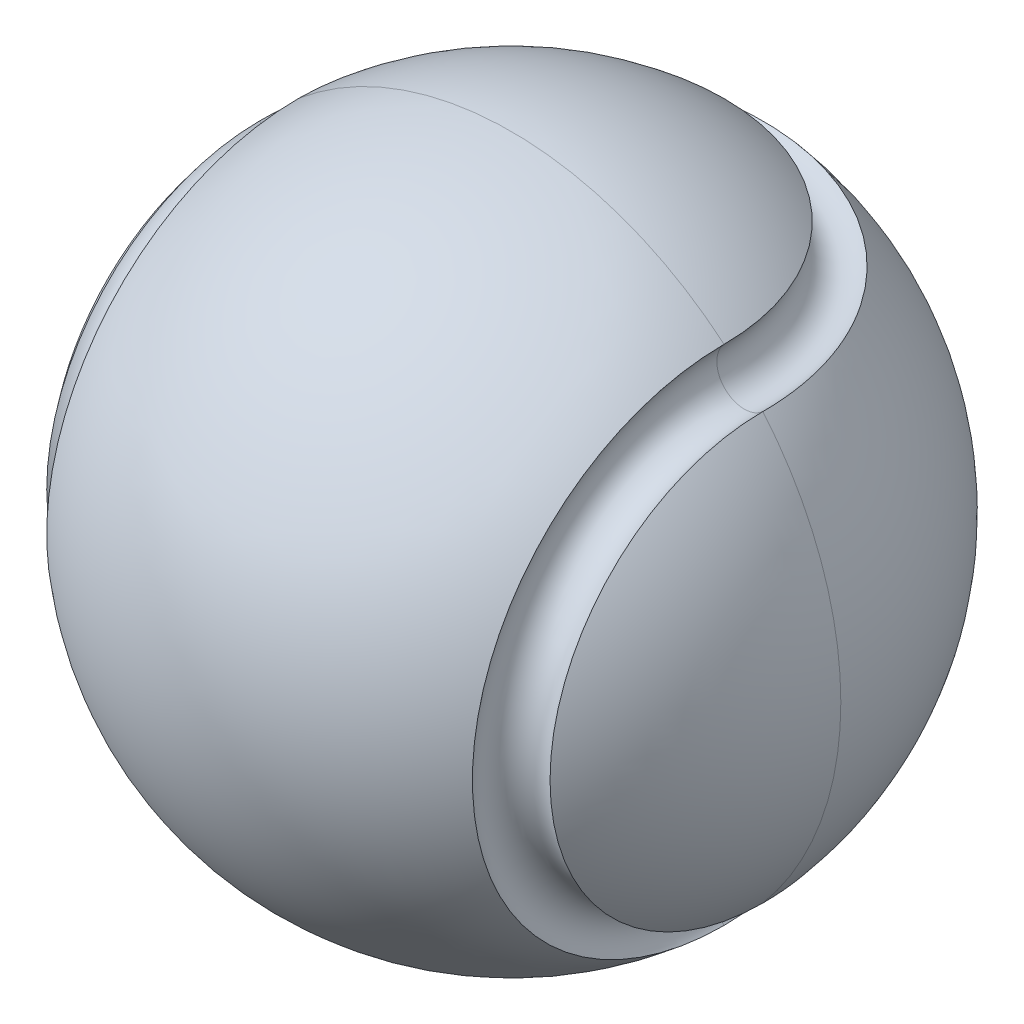
ISO-10303-21;
HEADER;
FILE_DESCRIPTION(('STEP AP214'),'2;1');
FILE_NAME('part.step','',(''),(''),'','','');
FILE_SCHEMA(('AUTOMOTIVE_DESIGN { 1 0 10303 214 1 1 1 1 }'));
ENDSEC;
DATA;
#1=APPLICATION_CONTEXT('core data for automotive mechanical design processes');
#2=APPLICATION_PROTOCOL_DEFINITION('international standard','automotive_design',2000,#1);
#3=PRODUCT_CONTEXT('',#1,'mechanical');
#4=PRODUCT('Part','Part','',(#3));
#5=PRODUCT_RELATED_PRODUCT_CATEGORY('part','',(#4));
#6=PRODUCT_DEFINITION_FORMATION('','',#4);
#7=PRODUCT_DEFINITION_CONTEXT('part definition',#1,'design');
#8=PRODUCT_DEFINITION('design','',#6,#7);
#9=PRODUCT_DEFINITION_SHAPE('','',#8);
#10=(LENGTH_UNIT() NAMED_UNIT(*) SI_UNIT(.MILLI.,.METRE.));
#11=(NAMED_UNIT(*) PLANE_ANGLE_UNIT() SI_UNIT($,.RADIAN.));
#12=(NAMED_UNIT(*) SI_UNIT($,.STERADIAN.) SOLID_ANGLE_UNIT());
#13=UNCERTAINTY_MEASURE_WITH_UNIT(LENGTH_MEASURE(1.E-05),#10,'distance_accuracy_value','');
#14=(GEOMETRIC_REPRESENTATION_CONTEXT(3) GLOBAL_UNCERTAINTY_ASSIGNED_CONTEXT((#13)) GLOBAL_UNIT_ASSIGNED_CONTEXT((#10,
#11,#12)) REPRESENTATION_CONTEXT('',''));
#15=CARTESIAN_POINT('',(0.,0.,0.));
#16=DIRECTION('',(0.,0.,1.));
#17=DIRECTION('',(1.,0.,0.));
#18=AXIS2_PLACEMENT_3D('',#15,#16,#17);
#19=CARTESIAN_POINT('',(0.,0.,0.));
#20=DIRECTION('',(-1.,0.,0.));
#21=DIRECTION('',(0.,1.,0.));
#22=AXIS2_PLACEMENT_3D('',#19,#20,#21);
#23=SPHERICAL_SURFACE('',#22,76.2);
#24=CARTESIAN_POINT('',(0.,0.,0.));
#25=DIRECTION('',(0.,0.,-1.));
#26=DIRECTION('',(-1.,0.,0.));
#27=AXIS2_PLACEMENT_3D('',#24,#25,#26);
#28=CIRCLE('',#27,76.2);
#29=CARTESIAN_POINT('',(49.2082193704713,58.1806767439806,0.));
#30=VERTEX_POINT('',#29);
#31=CARTESIAN_POINT('',(-49.2082193704713,58.1806767439807,0.));
#32=VERTEX_POINT('',#31);
#33=EDGE_CURVE('E130',#30,#32,#28,.F.);
#34=ORIENTED_EDGE('',*,*,#33,.T.);
#35=CARTESIAN_POINT('',(-49.2082193704713,0.,0.));
#36=DIRECTION('',(1.,0.,0.));
#37=DIRECTION('',(0.,1.,0.));
#38=AXIS2_PLACEMENT_3D('',#35,#36,#37);
#39=CIRCLE('',#38,58.1806767439806);
#40=CARTESIAN_POINT('',(-49.2082193704713,-58.1806767439806,0.));
#41=VERTEX_POINT('',#40);
#42=EDGE_CURVE('E66',#32,#41,#39,.T.);
#43=ORIENTED_EDGE('',*,*,#42,.T.);
#44=CARTESIAN_POINT('',(49.2082193704713,-58.1806767439807,0.));
#45=VERTEX_POINT('',#44);
#46=EDGE_CURVE('E103',#41,#45,#28,.F.);
#47=ORIENTED_EDGE('',*,*,#46,.T.);
#48=CARTESIAN_POINT('',(49.2082193704713,0.,0.));
#49=DIRECTION('',(-1.,0.,0.));
#50=DIRECTION('',(0.,-1.,0.));
#51=AXIS2_PLACEMENT_3D('',#48,#49,#50);
#52=CIRCLE('',#51,58.1806767439806);
#53=EDGE_CURVE('E96',#45,#30,#52,.T.);
#54=ORIENTED_EDGE('',*,*,#53,.T.);
#55=EDGE_LOOP('',(#34,#43,#47,#54));
#56=FACE_BOUND('',#55,.T.);
#57=ADVANCED_FACE('F59',(#56),#23,.T.);
#58=ORIENTED_EDGE('',*,*,#33,.F.);
#59=CARTESIAN_POINT('',(0.,58.1806767439806,0.));
#60=DIRECTION('',(0.,1.,0.));
#61=DIRECTION('',(0.,0.,1.));
#62=AXIS2_PLACEMENT_3D('',#59,#60,#61);
#63=CIRCLE('',#62,49.2082193704713);
#64=EDGE_CURVE('E141',#30,#32,#63,.T.);
#65=ORIENTED_EDGE('',*,*,#64,.T.);
#66=EDGE_LOOP('',(#58,#65));
#67=FACE_BOUND('',#66,.T.);
#68=ADVANCED_FACE('F155',(#67),#23,.T.);
#69=ORIENTED_EDGE('',*,*,#46,.F.);
#70=CARTESIAN_POINT('',(0.,-58.1806767439806,0.));
#71=DIRECTION('',(0.,-1.,0.));
#72=DIRECTION('',(0.,0.,-1.));
#73=AXIS2_PLACEMENT_3D('',#70,#71,#72);
#74=CIRCLE('',#73,49.2082193704713);
#75=EDGE_CURVE('E109',#41,#45,#74,.T.);
#76=ORIENTED_EDGE('',*,*,#75,.T.);
#77=EDGE_LOOP('',(#69,#76));
#78=FACE_BOUND('',#77,.T.);
#79=ADVANCED_FACE('F118',(#78),#23,.T.);
#80=CARTESIAN_POINT('',(0.,53.8815367264149,0.));
#81=DIRECTION('',(0.,-1.,0.));
#82=DIRECTION('',(0.,0.,-1.));
#83=AXIS2_PLACEMENT_3D('',#80,#81,#82);
#84=TOROIDAL_SURFACE('',#83,53.8815367264149,6.35);
#85=CARTESIAN_POINT('',(-53.8815367264149,53.8815367264149,0.));
#86=DIRECTION('',(0.,0.,-1.));
#87=DIRECTION('',(-1.,0.,0.));
#88=AXIS2_PLACEMENT_3D('',#85,#86,#87);
#89=CIRCLE('',#88,6.35);
#90=CARTESIAN_POINT('',(-58.1806767439807,49.2082193704712,0.));
#91=VERTEX_POINT('',#90);
#92=EDGE_CURVE('E119',#32,#91,#89,.T.);
#93=ORIENTED_EDGE('',*,*,#92,.F.);
#94=ORIENTED_EDGE('',*,*,#64,.F.);
#95=CARTESIAN_POINT('',(53.8815367264149,53.8815367264149,0.));
#96=DIRECTION('',(0.,0.,1.));
#97=DIRECTION('',(1.,0.,0.));
#98=AXIS2_PLACEMENT_3D('',#95,#96,#97);
#99=CIRCLE('',#98,6.35);
#100=CARTESIAN_POINT('',(58.1806767439806,49.2082193704712,0.));
#101=VERTEX_POINT('',#100);
#102=EDGE_CURVE('E73',#30,#101,#99,.T.);
#103=ORIENTED_EDGE('',*,*,#102,.T.);
#104=CARTESIAN_POINT('',(0.,49.2082193704713,0.));
#105=DIRECTION('',(0.,-1.,0.));
#106=DIRECTION('',(0.,0.,-1.));
#107=AXIS2_PLACEMENT_3D('',#104,#105,#106);
#108=CIRCLE('',#107,58.1806767439806);
#109=EDGE_CURVE('E134',#91,#101,#108,.T.);
#110=ORIENTED_EDGE('',*,*,#109,.F.);
#111=EDGE_LOOP('',(#93,#94,#103,#110));
#112=FACE_BOUND('',#111,.T.);
#113=ADVANCED_FACE('F153',(#112),#84,.F.);
#114=CARTESIAN_POINT('',(-53.8815367264149,0.,0.));
#115=DIRECTION('',(-1.,0.,0.));
#116=DIRECTION('',(0.,0.,1.));
#117=AXIS2_PLACEMENT_3D('',#114,#115,#116);
#118=TOROIDAL_SURFACE('',#117,53.8815367264149,6.35);
#119=CARTESIAN_POINT('',(-53.8815367264149,-53.8815367264149,0.));
#120=DIRECTION('',(0.,0.,1.));
#121=DIRECTION('',(-1.,0.,0.));
#122=AXIS2_PLACEMENT_3D('',#119,#120,#121);
#123=CIRCLE('',#122,6.35);
#124=CARTESIAN_POINT('',(-58.1806767439807,-49.2082193704713,0.));
#125=VERTEX_POINT('',#124);
#126=EDGE_CURVE('E114',#41,#125,#123,.T.);
#127=ORIENTED_EDGE('',*,*,#126,.F.);
#128=ORIENTED_EDGE('',*,*,#42,.F.);
#129=ORIENTED_EDGE('',*,*,#92,.T.);
#130=CARTESIAN_POINT('',(-58.1806767439807,0.,0.));
#131=DIRECTION('',(-1.,0.,0.));
#132=DIRECTION('',(0.,-1.,0.));
#133=AXIS2_PLACEMENT_3D('',#130,#131,#132);
#134=CIRCLE('',#133,49.2082193704713);
#135=EDGE_CURVE('E12',#125,#91,#134,.T.);
#136=ORIENTED_EDGE('',*,*,#135,.F.);
#137=EDGE_LOOP('',(#127,#128,#129,#136));
#138=FACE_BOUND('',#137,.T.);
#139=ADVANCED_FACE('F176',(#138),#118,.F.);
#140=CARTESIAN_POINT('',(0.,-53.8815367264149,0.));
#141=DIRECTION('',(0.,1.,0.));
#142=DIRECTION('',(0.,0.,1.));
#143=AXIS2_PLACEMENT_3D('',#140,#141,#142);
#144=TOROIDAL_SURFACE('',#143,53.8815367264149,6.35);
#145=CARTESIAN_POINT('',(53.8815367264149,-53.8815367264149,0.));
#146=DIRECTION('',(0.,0.,-1.));
#147=DIRECTION('',(1.,0.,0.));
#148=AXIS2_PLACEMENT_3D('',#145,#146,#147);
#149=CIRCLE('',#148,6.35);
#150=CARTESIAN_POINT('',(58.1806767439807,-49.2082193704713,0.));
#151=VERTEX_POINT('',#150);
#152=EDGE_CURVE('E78',#45,#151,#149,.T.);
#153=ORIENTED_EDGE('',*,*,#152,.F.);
#154=ORIENTED_EDGE('',*,*,#75,.F.);
#155=ORIENTED_EDGE('',*,*,#126,.T.);
#156=CARTESIAN_POINT('',(0.,-49.2082193704713,0.));
#157=DIRECTION('',(0.,1.,0.));
#158=DIRECTION('',(0.,0.,1.));
#159=AXIS2_PLACEMENT_3D('',#156,#157,#158);
#160=CIRCLE('',#159,58.1806767439806);
#161=EDGE_CURVE('E112',#151,#125,#160,.T.);
#162=ORIENTED_EDGE('',*,*,#161,.F.);
#163=EDGE_LOOP('',(#153,#154,#155,#162));
#164=FACE_BOUND('',#163,.T.);
#165=ADVANCED_FACE('F107',(#164),#144,.F.);
#166=CARTESIAN_POINT('',(53.8815367264149,0.,0.));
#167=DIRECTION('',(1.,0.,0.));
#168=DIRECTION('',(0.,0.,-1.));
#169=AXIS2_PLACEMENT_3D('',#166,#167,#168);
#170=TOROIDAL_SURFACE('',#169,53.8815367264149,6.35);
#171=ORIENTED_EDGE('',*,*,#102,.F.);
#172=ORIENTED_EDGE('',*,*,#53,.F.);
#173=ORIENTED_EDGE('',*,*,#152,.T.);
#174=CARTESIAN_POINT('',(58.1806767439806,0.,0.));
#175=DIRECTION('',(1.,0.,0.));
#176=DIRECTION('',(0.,1.,0.));
#177=AXIS2_PLACEMENT_3D('',#174,#175,#176);
#178=CIRCLE('',#177,49.2082193704713);
#179=EDGE_CURVE('E102',#101,#151,#178,.T.);
#180=ORIENTED_EDGE('',*,*,#179,.F.);
#181=EDGE_LOOP('',(#171,#172,#173,#180));
#182=FACE_BOUND('',#181,.T.);
#183=ADVANCED_FACE('F97',(#182),#170,.F.);
#184=EDGE_CURVE('E125',#91,#125,#28,.F.);
#185=ORIENTED_EDGE('',*,*,#184,.T.);
#186=ORIENTED_EDGE('',*,*,#135,.T.);
#187=EDGE_LOOP('',(#185,#186));
#188=FACE_BOUND('',#187,.T.);
#189=ADVANCED_FACE('F162',(#188),#23,.T.);
#190=EDGE_CURVE('E123',#151,#101,#28,.F.);
#191=ORIENTED_EDGE('',*,*,#190,.T.);
#192=ORIENTED_EDGE('',*,*,#179,.T.);
#193=EDGE_LOOP('',(#191,#192));
#194=FACE_BOUND('',#193,.T.);
#195=ADVANCED_FACE('F166',(#194),#23,.T.);
#196=ORIENTED_EDGE('',*,*,#184,.F.);
#197=ORIENTED_EDGE('',*,*,#109,.T.);
#198=ORIENTED_EDGE('',*,*,#190,.F.);
#199=ORIENTED_EDGE('',*,*,#161,.T.);
#200=EDGE_LOOP('',(#196,#197,#198,#199));
#201=FACE_BOUND('',#200,.T.);
#202=ADVANCED_FACE('F161',(#201),#23,.T.);
#203=CLOSED_SHELL('',(#57,#68,#79,#113,#139,#165,#183,#189,#195,#202));
#204=MANIFOLD_SOLID_BREP('B2',#203);
#205=ADVANCED_BREP_SHAPE_REPRESENTATION('',(#18,#204),#14);
#206=SHAPE_DEFINITION_REPRESENTATION(#9,#205);
ENDSEC;
END-ISO-10303-21;
